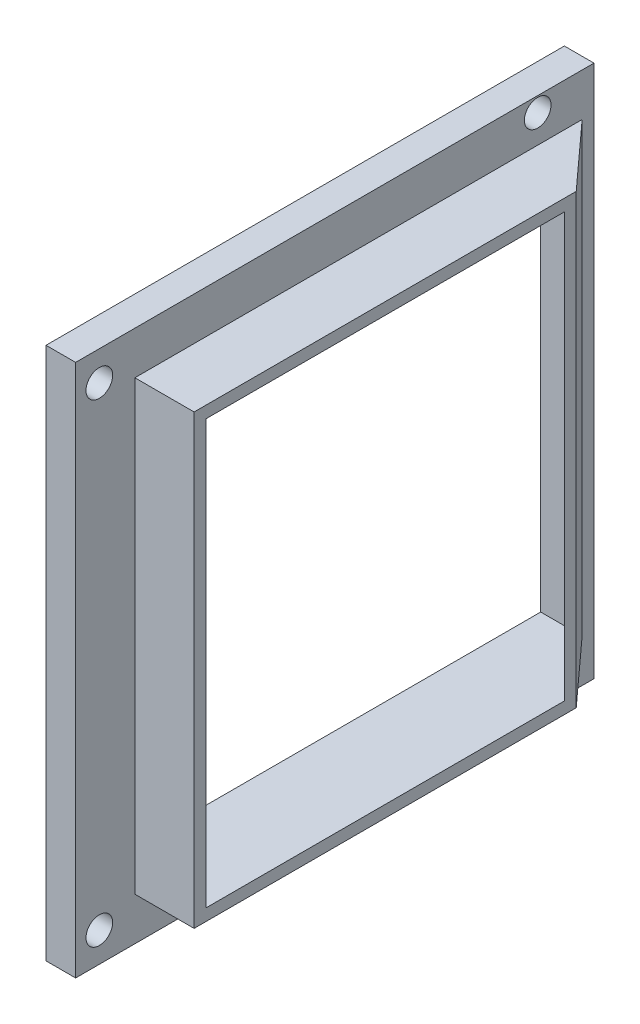
ISO-10303-21;
HEADER;
FILE_DESCRIPTION(('STEP AP214'),'2;1');
FILE_NAME('part.step','',(''),(''),'','','');
FILE_SCHEMA(('AUTOMOTIVE_DESIGN { 1 0 10303 214 1 1 1 1 }'));
ENDSEC;
DATA;
#1=APPLICATION_CONTEXT('core data for automotive mechanical design processes');
#2=APPLICATION_PROTOCOL_DEFINITION('international standard','automotive_design',2000,#1);
#3=PRODUCT_CONTEXT('',#1,'mechanical');
#4=PRODUCT('Part','Part','',(#3));
#5=PRODUCT_RELATED_PRODUCT_CATEGORY('part','',(#4));
#6=PRODUCT_DEFINITION_FORMATION('','',#4);
#7=PRODUCT_DEFINITION_CONTEXT('part definition',#1,'design');
#8=PRODUCT_DEFINITION('design','',#6,#7);
#9=PRODUCT_DEFINITION_SHAPE('','',#8);
#10=(LENGTH_UNIT() NAMED_UNIT(*) SI_UNIT(.MILLI.,.METRE.));
#11=(NAMED_UNIT(*) PLANE_ANGLE_UNIT() SI_UNIT($,.RADIAN.));
#12=(NAMED_UNIT(*) SI_UNIT($,.STERADIAN.) SOLID_ANGLE_UNIT());
#13=UNCERTAINTY_MEASURE_WITH_UNIT(LENGTH_MEASURE(1.E-05),#10,'distance_accuracy_value','');
#14=(GEOMETRIC_REPRESENTATION_CONTEXT(3) GLOBAL_UNCERTAINTY_ASSIGNED_CONTEXT((#13)) GLOBAL_UNIT_ASSIGNED_CONTEXT((#10,
#11,#12)) REPRESENTATION_CONTEXT('',''));
#15=CARTESIAN_POINT('',(0.,0.,0.));
#16=DIRECTION('',(0.,0.,1.));
#17=DIRECTION('',(1.,0.,0.));
#18=AXIS2_PLACEMENT_3D('',#15,#16,#17);
#19=CARTESIAN_POINT('',(5.,0.,0.));
#20=DIRECTION('',(-1.,0.,0.));
#21=DIRECTION('',(0.,0.,1.));
#22=AXIS2_PLACEMENT_3D('',#19,#20,#21);
#23=PLANE('',#22);
#24=CARTESIAN_POINT('',(5.,40.,39.75));
#25=DIRECTION('',(1.,0.,0.));
#26=DIRECTION('',(0.,0.,-1.));
#27=AXIS2_PLACEMENT_3D('',#24,#25,#26);
#28=CIRCLE('',#27,2.25);
#29=CARTESIAN_POINT('',(5.,40.,37.5));
#30=VERTEX_POINT('',#29);
#31=EDGE_CURVE('E191',#30,#30,#28,.T.);
#32=ORIENTED_EDGE('',*,*,#31,.F.);
#33=EDGE_LOOP('',(#32));
#34=FACE_BOUND('',#33,.T.);
#35=CARTESIAN_POINT('',(5.,42.5,-34.25));
#36=DIRECTION('',(1.,0.,0.));
#37=DIRECTION('',(0.,0.,-1.));
#38=AXIS2_PLACEMENT_3D('',#35,#36,#37);
#39=CIRCLE('',#38,2.25);
#40=CARTESIAN_POINT('',(5.,42.5,-36.5));
#41=VERTEX_POINT('',#40);
#42=EDGE_CURVE('E199',#41,#41,#39,.T.);
#43=ORIENTED_EDGE('',*,*,#42,.F.);
#44=EDGE_LOOP('',(#43));
#45=FACE_BOUND('',#44,.T.);
#46=CARTESIAN_POINT('',(5.,-42.5,-34.25));
#47=DIRECTION('',(1.,0.,0.));
#48=DIRECTION('',(0.,0.,-1.));
#49=AXIS2_PLACEMENT_3D('',#46,#47,#48);
#50=CIRCLE('',#49,2.25);
#51=CARTESIAN_POINT('',(5.,-42.5,-36.5));
#52=VERTEX_POINT('',#51);
#53=EDGE_CURVE('E186',#52,#52,#50,.T.);
#54=ORIENTED_EDGE('',*,*,#53,.F.);
#55=EDGE_LOOP('',(#54));
#56=FACE_BOUND('',#55,.T.);
#57=DIRECTION('',(0.,-1.,0.));
#58=VECTOR('',#57,1.);
#59=CARTESIAN_POINT('',(5.,-45.,43.75));
#60=LINE('',#59,#58);
#61=CARTESIAN_POINT('',(5.,45.,43.75));
#62=VERTEX_POINT('',#61);
#63=CARTESIAN_POINT('',(5.,-45.,43.75));
#64=VERTEX_POINT('',#63);
#65=EDGE_CURVE('E245',#62,#64,#60,.T.);
#66=ORIENTED_EDGE('',*,*,#65,.T.);
#67=DIRECTION('',(0.,0.,-1.));
#68=VECTOR('',#67,1.);
#69=CARTESIAN_POINT('',(5.,-45.,43.75));
#70=LINE('',#69,#68);
#71=CARTESIAN_POINT('',(5.,-45.,-43.75));
#72=VERTEX_POINT('',#71);
#73=EDGE_CURVE('E248',#64,#72,#70,.T.);
#74=ORIENTED_EDGE('',*,*,#73,.T.);
#75=DIRECTION('',(0.,1.,0.));
#76=VECTOR('',#75,1.);
#77=CARTESIAN_POINT('',(5.,-45.,-43.75));
#78=LINE('',#77,#76);
#79=CARTESIAN_POINT('',(5.,45.,-43.75));
#80=VERTEX_POINT('',#79);
#81=EDGE_CURVE('E238',#72,#80,#78,.T.);
#82=ORIENTED_EDGE('',*,*,#81,.T.);
#83=DIRECTION('',(0.,0.,1.));
#84=VECTOR('',#83,1.);
#85=CARTESIAN_POINT('',(5.,45.,43.75));
#86=LINE('',#85,#84);
#87=EDGE_CURVE('E241',#80,#62,#86,.T.);
#88=ORIENTED_EDGE('',*,*,#87,.T.);
#89=EDGE_LOOP('',(#66,#74,#82,#88));
#90=FACE_BOUND('',#89,.T.);
#91=CARTESIAN_POINT('',(5.,-40.,39.75));
#92=DIRECTION('',(1.,0.,0.));
#93=DIRECTION('',(0.,0.,-1.));
#94=AXIS2_PLACEMENT_3D('',#91,#92,#93);
#95=CIRCLE('',#94,2.25);
#96=CARTESIAN_POINT('',(5.,-40.,37.5));
#97=VERTEX_POINT('',#96);
#98=EDGE_CURVE('E176',#97,#97,#95,.T.);
#99=ORIENTED_EDGE('',*,*,#98,.F.);
#100=EDGE_LOOP('',(#99));
#101=FACE_BOUND('',#100,.T.);
#102=DIRECTION('',(0.,1.,0.));
#103=VECTOR('',#102,1.);
#104=CARTESIAN_POINT('',(5.,-45.,-41.75));
#105=LINE('',#104,#103);
#106=CARTESIAN_POINT('',(5.,-37.75,-41.75));
#107=VERTEX_POINT('',#106);
#108=CARTESIAN_POINT('',(5.,37.75,-41.75));
#109=VERTEX_POINT('',#108);
#110=EDGE_CURVE('E159',#107,#109,#105,.T.);
#111=ORIENTED_EDGE('',*,*,#110,.F.);
#112=DIRECTION('',(0.,0.,-1.));
#113=VECTOR('',#112,1.);
#114=CARTESIAN_POINT('',(5.,-37.75,43.75));
#115=LINE('',#114,#113);
#116=CARTESIAN_POINT('',(5.,-37.75,33.75));
#117=VERTEX_POINT('',#116);
#118=EDGE_CURVE('E146',#117,#107,#115,.T.);
#119=ORIENTED_EDGE('',*,*,#118,.F.);
#120=DIRECTION('',(0.,1.,0.));
#121=VECTOR('',#120,1.);
#122=CARTESIAN_POINT('',(5.,-45.,33.75));
#123=LINE('',#122,#121);
#124=CARTESIAN_POINT('',(5.,37.75,33.75));
#125=VERTEX_POINT('',#124);
#126=EDGE_CURVE('E163',#117,#125,#123,.T.);
#127=ORIENTED_EDGE('',*,*,#126,.T.);
#128=DIRECTION('',(0.,0.,-1.));
#129=VECTOR('',#128,1.);
#130=CARTESIAN_POINT('',(5.,37.75,43.75));
#131=LINE('',#130,#129);
#132=EDGE_CURVE('E357',#125,#109,#131,.T.);
#133=ORIENTED_EDGE('',*,*,#132,.T.);
#134=EDGE_LOOP('',(#111,#119,#127,#133));
#135=FACE_BOUND('',#134,.T.);
#136=ADVANCED_FACE('F41',(#34,#45,#56,#90,#101,#135),#23,.F.);
#137=CARTESIAN_POINT('',(5.,-45.,43.75));
#138=DIRECTION('',(0.,1.,0.));
#139=DIRECTION('',(0.,0.,1.));
#140=AXIS2_PLACEMENT_3D('',#137,#138,#139);
#141=PLANE('',#140);
#142=DIRECTION('',(-1.,0.,0.));
#143=VECTOR('',#142,1.);
#144=CARTESIAN_POINT('',(5.,-45.,-43.75));
#145=LINE('',#144,#143);
#146=CARTESIAN_POINT('',(0.,-45.,-43.75));
#147=VERTEX_POINT('',#146);
#148=EDGE_CURVE('E251',#72,#147,#145,.T.);
#149=ORIENTED_EDGE('',*,*,#148,.F.);
#150=ORIENTED_EDGE('',*,*,#73,.F.);
#151=DIRECTION('',(-1.,0.,0.));
#152=VECTOR('',#151,1.);
#153=CARTESIAN_POINT('',(5.,-45.,43.75));
#154=LINE('',#153,#152);
#155=CARTESIAN_POINT('',(0.,-45.,43.75));
#156=VERTEX_POINT('',#155);
#157=EDGE_CURVE('E266',#64,#156,#154,.T.);
#158=ORIENTED_EDGE('',*,*,#157,.T.);
#159=DIRECTION('',(0.,0.,-1.));
#160=VECTOR('',#159,1.);
#161=CARTESIAN_POINT('',(0.,-45.,43.75));
#162=LINE('',#161,#160);
#163=EDGE_CURVE('E242',#156,#147,#162,.T.);
#164=ORIENTED_EDGE('',*,*,#163,.T.);
#165=EDGE_LOOP('',(#149,#150,#158,#164));
#166=FACE_BOUND('',#165,.T.);
#167=ADVANCED_FACE('F315',(#166),#141,.F.);
#168=CARTESIAN_POINT('',(5.,45.,43.75));
#169=DIRECTION('',(0.,-1.,0.));
#170=DIRECTION('',(0.,0.,-1.));
#171=AXIS2_PLACEMENT_3D('',#168,#169,#170);
#172=PLANE('',#171);
#173=DIRECTION('',(-1.,0.,0.));
#174=VECTOR('',#173,1.);
#175=CARTESIAN_POINT('',(5.,45.,43.75));
#176=LINE('',#175,#174);
#177=CARTESIAN_POINT('',(0.,45.,43.75));
#178=VERTEX_POINT('',#177);
#179=EDGE_CURVE('E270',#62,#178,#176,.T.);
#180=ORIENTED_EDGE('',*,*,#179,.F.);
#181=ORIENTED_EDGE('',*,*,#87,.F.);
#182=DIRECTION('',(-1.,0.,0.));
#183=VECTOR('',#182,1.);
#184=CARTESIAN_POINT('',(5.,45.,-43.75));
#185=LINE('',#184,#183);
#186=CARTESIAN_POINT('',(0.,45.,-43.75));
#187=VERTEX_POINT('',#186);
#188=EDGE_CURVE('E50',#80,#187,#185,.T.);
#189=ORIENTED_EDGE('',*,*,#188,.T.);
#190=DIRECTION('',(0.,0.,1.));
#191=VECTOR('',#190,1.);
#192=CARTESIAN_POINT('',(0.,45.,43.75));
#193=LINE('',#192,#191);
#194=EDGE_CURVE('E255',#187,#178,#193,.T.);
#195=ORIENTED_EDGE('',*,*,#194,.T.);
#196=EDGE_LOOP('',(#180,#181,#189,#195));
#197=FACE_BOUND('',#196,.T.);
#198=ADVANCED_FACE('F307',(#197),#172,.F.);
#199=CARTESIAN_POINT('',(5.,-35.75,31.75));
#200=DIRECTION('',(0.,0.,-1.));
#201=DIRECTION('',(-1.,0.,0.));
#202=AXIS2_PLACEMENT_3D('',#199,#200,#201);
#203=PLANE('',#202);
#204=DIRECTION('',(0.,1.,0.));
#205=VECTOR('',#204,1.);
#206=CARTESIAN_POINT('',(15.,-45.,31.75));
#207=LINE('',#206,#205);
#208=CARTESIAN_POINT('',(15.,-35.75,31.75));
#209=VERTEX_POINT('',#208);
#210=CARTESIAN_POINT('',(15.,35.75,31.75));
#211=VERTEX_POINT('',#210);
#212=EDGE_CURVE('E57',#209,#211,#207,.T.);
#213=ORIENTED_EDGE('',*,*,#212,.F.);
#214=DIRECTION('',(-1.,0.,0.));
#215=VECTOR('',#214,1.);
#216=CARTESIAN_POINT('',(5.,-35.75,31.75));
#217=LINE('',#216,#215);
#218=CARTESIAN_POINT('',(0.,-35.75,31.75));
#219=VERTEX_POINT('',#218);
#220=EDGE_CURVE('E144',#209,#219,#217,.T.);
#221=ORIENTED_EDGE('',*,*,#220,.T.);
#222=DIRECTION('',(0.,-1.,0.));
#223=VECTOR('',#222,1.);
#224=CARTESIAN_POINT('',(0.,-35.75,31.75));
#225=LINE('',#224,#223);
#226=CARTESIAN_POINT('',(0.,35.75,31.75));
#227=VERTEX_POINT('',#226);
#228=EDGE_CURVE('E219',#227,#219,#225,.T.);
#229=ORIENTED_EDGE('',*,*,#228,.F.);
#230=DIRECTION('',(-1.,0.,0.));
#231=VECTOR('',#230,1.);
#232=CARTESIAN_POINT('',(5.,35.75,31.75));
#233=LINE('',#232,#231);
#234=EDGE_CURVE('E230',#211,#227,#233,.T.);
#235=ORIENTED_EDGE('',*,*,#234,.F.);
#236=EDGE_LOOP('',(#213,#221,#229,#235));
#237=FACE_BOUND('',#236,.T.);
#238=ADVANCED_FACE('F304',(#237),#203,.T.);
#239=CARTESIAN_POINT('',(0.,-45.,33.75));
#240=DIRECTION('',(0.,0.,1.));
#241=DIRECTION('',(1.,0.,0.));
#242=AXIS2_PLACEMENT_3D('',#239,#240,#241);
#243=PLANE('',#242);
#244=DIRECTION('',(-1.,0.,0.));
#245=VECTOR('',#244,1.);
#246=CARTESIAN_POINT('',(0.,-37.75,33.75));
#247=LINE('',#246,#245);
#248=CARTESIAN_POINT('',(15.,-37.75,33.75));
#249=VERTEX_POINT('',#248);
#250=EDGE_CURVE('E366',#249,#117,#247,.T.);
#251=ORIENTED_EDGE('',*,*,#250,.F.);
#252=DIRECTION('',(0.,1.,0.));
#253=VECTOR('',#252,1.);
#254=CARTESIAN_POINT('',(15.,-45.,33.75));
#255=LINE('',#254,#253);
#256=CARTESIAN_POINT('',(15.,37.75,33.75));
#257=VERTEX_POINT('',#256);
#258=EDGE_CURVE('E173',#249,#257,#255,.T.);
#259=ORIENTED_EDGE('',*,*,#258,.T.);
#260=DIRECTION('',(-1.,0.,0.));
#261=VECTOR('',#260,1.);
#262=CARTESIAN_POINT('',(0.,37.75,33.75));
#263=LINE('',#262,#261);
#264=EDGE_CURVE('E168',#257,#125,#263,.T.);
#265=ORIENTED_EDGE('',*,*,#264,.T.);
#266=ORIENTED_EDGE('',*,*,#126,.F.);
#267=EDGE_LOOP('',(#251,#259,#265,#266));
#268=FACE_BOUND('',#267,.T.);
#269=ADVANCED_FACE('F306',(#268),#243,.T.);
#270=CARTESIAN_POINT('',(15.,-45.,0.));
#271=DIRECTION('',(1.,0.,0.));
#272=DIRECTION('',(0.,0.,-1.));
#273=AXIS2_PLACEMENT_3D('',#270,#271,#272);
#274=PLANE('',#273);
#275=DIRECTION('',(0.,0.,-1.));
#276=VECTOR('',#275,1.);
#277=CARTESIAN_POINT('',(15.,-35.75,-28.75));
#278=LINE('',#277,#276);
#279=CARTESIAN_POINT('',(15.,-35.75,-28.75));
#280=VERTEX_POINT('',#279);
#281=EDGE_CURVE('E138',#209,#280,#278,.T.);
#282=ORIENTED_EDGE('',*,*,#281,.F.);
#283=ORIENTED_EDGE('',*,*,#212,.T.);
#284=DIRECTION('',(0.,0.,-1.));
#285=VECTOR('',#284,1.);
#286=CARTESIAN_POINT('',(15.,35.75,-28.75));
#287=LINE('',#286,#285);
#288=CARTESIAN_POINT('',(15.,35.75,-28.75));
#289=VERTEX_POINT('',#288);
#290=EDGE_CURVE('E157',#211,#289,#287,.T.);
#291=ORIENTED_EDGE('',*,*,#290,.T.);
#292=DIRECTION('',(0.,1.,0.));
#293=VECTOR('',#292,1.);
#294=CARTESIAN_POINT('',(15.,-45.,-28.75));
#295=LINE('',#294,#293);
#296=EDGE_CURVE('E65',#280,#289,#295,.T.);
#297=ORIENTED_EDGE('',*,*,#296,.F.);
#298=EDGE_LOOP('',(#282,#283,#291,#297));
#299=FACE_BOUND('',#298,.T.);
#300=DIRECTION('',(0.,0.,-1.));
#301=VECTOR('',#300,1.);
#302=CARTESIAN_POINT('',(15.,-37.75,43.75));
#303=LINE('',#302,#301);
#304=CARTESIAN_POINT('',(15.,-37.75,-30.75));
#305=VERTEX_POINT('',#304);
#306=EDGE_CURVE('E367',#249,#305,#303,.T.);
#307=ORIENTED_EDGE('',*,*,#306,.T.);
#308=DIRECTION('',(0.,1.,0.));
#309=VECTOR('',#308,1.);
#310=CARTESIAN_POINT('',(15.,-45.,-30.75));
#311=LINE('',#310,#309);
#312=CARTESIAN_POINT('',(15.,37.75,-30.75));
#313=VERTEX_POINT('',#312);
#314=EDGE_CURVE('E165',#305,#313,#311,.T.);
#315=ORIENTED_EDGE('',*,*,#314,.T.);
#316=DIRECTION('',(0.,0.,-1.));
#317=VECTOR('',#316,1.);
#318=CARTESIAN_POINT('',(15.,37.75,43.75));
#319=LINE('',#318,#317);
#320=EDGE_CURVE('E379',#257,#313,#319,.T.);
#321=ORIENTED_EDGE('',*,*,#320,.F.);
#322=ORIENTED_EDGE('',*,*,#258,.F.);
#323=EDGE_LOOP('',(#307,#315,#321,#322));
#324=FACE_BOUND('',#323,.T.);
#325=ADVANCED_FACE('F154',(#299,#324),#274,.T.);
#326=CARTESIAN_POINT('',(22.5226244343891,-45.,-20.4751131221719));
#327=DIRECTION('',(-0.739940073395944,0.,0.672672793996312));
#328=DIRECTION('',(0.672672793996312,0.,0.739940073395944));
#329=AXIS2_PLACEMENT_3D('',#326,#327,#328);
#330=PLANE('',#329);
#331=DIRECTION('',(-0.672672793996312,0.,-0.739940073395944));
#332=VECTOR('',#331,1.);
#333=CARTESIAN_POINT('',(5.,-35.75,-39.75));
#334=LINE('',#333,#332);
#335=CARTESIAN_POINT('',(5.,-35.75,-39.75));
#336=VERTEX_POINT('',#335);
#337=EDGE_CURVE('E142',#280,#336,#334,.T.);
#338=ORIENTED_EDGE('',*,*,#337,.F.);
#339=ORIENTED_EDGE('',*,*,#296,.T.);
#340=DIRECTION('',(-0.672672793996312,0.,-0.739940073395944));
#341=VECTOR('',#340,1.);
#342=CARTESIAN_POINT('',(5.,35.75,-39.75));
#343=LINE('',#342,#341);
#344=CARTESIAN_POINT('',(5.,35.75,-39.75));
#345=VERTEX_POINT('',#344);
#346=EDGE_CURVE('E302',#289,#345,#343,.T.);
#347=ORIENTED_EDGE('',*,*,#346,.T.);
#348=DIRECTION('',(0.,1.,0.));
#349=VECTOR('',#348,1.);
#350=CARTESIAN_POINT('',(5.,-35.75,-39.75));
#351=LINE('',#350,#349);
#352=EDGE_CURVE('E150',#336,#345,#351,.T.);
#353=ORIENTED_EDGE('',*,*,#352,.F.);
#354=EDGE_LOOP('',(#338,#339,#347,#353));
#355=FACE_BOUND('',#354,.T.);
#356=ADVANCED_FACE('F148',(#355),#330,.T.);
#357=CARTESIAN_POINT('',(23.5180995475113,-45.,-21.3800904977376));
#358=DIRECTION('',(0.739940073395944,0.,-0.672672793996312));
#359=DIRECTION('',(-0.672672793996312,0.,-0.739940073395944));
#360=AXIS2_PLACEMENT_3D('',#357,#358,#359);
#361=PLANE('',#360);
#362=DIRECTION('',(0.672672793996312,0.,0.739940073395944));
#363=VECTOR('',#362,1.);
#364=CARTESIAN_POINT('',(23.5180995475113,-37.75,-21.3800904977376));
#365=LINE('',#364,#363);
#366=EDGE_CURVE('E363',#107,#305,#365,.T.);
#367=ORIENTED_EDGE('',*,*,#366,.F.);
#368=ORIENTED_EDGE('',*,*,#110,.T.);
#369=DIRECTION('',(0.672672793996312,0.,0.739940073395944));
#370=VECTOR('',#369,1.);
#371=CARTESIAN_POINT('',(23.5180995475113,37.75,-21.3800904977376));
#372=LINE('',#371,#370);
#373=EDGE_CURVE('E11',#109,#313,#372,.T.);
#374=ORIENTED_EDGE('',*,*,#373,.T.);
#375=ORIENTED_EDGE('',*,*,#314,.F.);
#376=EDGE_LOOP('',(#367,#368,#374,#375));
#377=FACE_BOUND('',#376,.T.);
#378=ADVANCED_FACE('F286',(#377),#361,.T.);
#379=CARTESIAN_POINT('',(0.,0.,0.));
#380=DIRECTION('',(-1.,0.,0.));
#381=DIRECTION('',(0.,0.,1.));
#382=AXIS2_PLACEMENT_3D('',#379,#380,#381);
#383=PLANE('',#382);
#384=CARTESIAN_POINT('',(0.,-40.,39.75));
#385=DIRECTION('',(-1.,0.,0.));
#386=DIRECTION('',(0.,0.,1.));
#387=AXIS2_PLACEMENT_3D('',#384,#385,#386);
#388=CIRCLE('',#387,2.25);
#389=CARTESIAN_POINT('',(0.,-40.,42.));
#390=VERTEX_POINT('',#389);
#391=EDGE_CURVE('E182',#390,#390,#388,.T.);
#392=ORIENTED_EDGE('',*,*,#391,.F.);
#393=EDGE_LOOP('',(#392));
#394=FACE_BOUND('',#393,.T.);
#395=CARTESIAN_POINT('',(0.,-42.5,-34.25));
#396=DIRECTION('',(-1.,0.,0.));
#397=DIRECTION('',(0.,0.,1.));
#398=AXIS2_PLACEMENT_3D('',#395,#396,#397);
#399=CIRCLE('',#398,2.25);
#400=CARTESIAN_POINT('',(0.,-42.5,-32.));
#401=VERTEX_POINT('',#400);
#402=EDGE_CURVE('E190',#401,#401,#399,.T.);
#403=ORIENTED_EDGE('',*,*,#402,.F.);
#404=EDGE_LOOP('',(#403));
#405=FACE_BOUND('',#404,.T.);
#406=CARTESIAN_POINT('',(0.,40.,39.75));
#407=DIRECTION('',(-1.,0.,0.));
#408=DIRECTION('',(0.,0.,1.));
#409=AXIS2_PLACEMENT_3D('',#406,#407,#408);
#410=CIRCLE('',#409,2.25);
#411=CARTESIAN_POINT('',(0.,40.,42.));
#412=VERTEX_POINT('',#411);
#413=EDGE_CURVE('E195',#412,#412,#410,.T.);
#414=ORIENTED_EDGE('',*,*,#413,.F.);
#415=EDGE_LOOP('',(#414));
#416=FACE_BOUND('',#415,.T.);
#417=CARTESIAN_POINT('',(0.,42.5,-34.25));
#418=DIRECTION('',(-1.,0.,0.));
#419=DIRECTION('',(0.,0.,1.));
#420=AXIS2_PLACEMENT_3D('',#417,#418,#419);
#421=CIRCLE('',#420,2.25);
#422=CARTESIAN_POINT('',(0.,42.5,-32.));
#423=VERTEX_POINT('',#422);
#424=EDGE_CURVE('E203',#423,#423,#421,.T.);
#425=ORIENTED_EDGE('',*,*,#424,.F.);
#426=EDGE_LOOP('',(#425));
#427=FACE_BOUND('',#426,.T.);
#428=DIRECTION('',(0.,1.,0.));
#429=VECTOR('',#428,1.);
#430=CARTESIAN_POINT('',(0.,-45.,-43.75));
#431=LINE('',#430,#429);
#432=EDGE_CURVE('E237',#147,#187,#431,.T.);
#433=ORIENTED_EDGE('',*,*,#432,.F.);
#434=ORIENTED_EDGE('',*,*,#163,.F.);
#435=DIRECTION('',(0.,-1.,0.));
#436=VECTOR('',#435,1.);
#437=CARTESIAN_POINT('',(0.,-45.,43.75));
#438=LINE('',#437,#436);
#439=EDGE_CURVE('E258',#178,#156,#438,.T.);
#440=ORIENTED_EDGE('',*,*,#439,.F.);
#441=ORIENTED_EDGE('',*,*,#194,.F.);
#442=EDGE_LOOP('',(#433,#434,#440,#441));
#443=FACE_BOUND('',#442,.T.);
#444=DIRECTION('',(0.,0.,-1.));
#445=VECTOR('',#444,1.);
#446=CARTESIAN_POINT('',(0.,-35.75,31.75));
#447=LINE('',#446,#445);
#448=CARTESIAN_POINT('',(0.,-35.75,-39.75));
#449=VERTEX_POINT('',#448);
#450=EDGE_CURVE('E211',#219,#449,#447,.T.);
#451=ORIENTED_EDGE('',*,*,#450,.T.);
#452=DIRECTION('',(0.,1.,0.));
#453=VECTOR('',#452,1.);
#454=CARTESIAN_POINT('',(0.,-35.75,-39.75));
#455=LINE('',#454,#453);
#456=CARTESIAN_POINT('',(0.,35.75,-39.75));
#457=VERTEX_POINT('',#456);
#458=EDGE_CURVE('E207',#449,#457,#455,.T.);
#459=ORIENTED_EDGE('',*,*,#458,.T.);
#460=DIRECTION('',(0.,0.,1.));
#461=VECTOR('',#460,1.);
#462=CARTESIAN_POINT('',(0.,35.75,31.75));
#463=LINE('',#462,#461);
#464=EDGE_CURVE('E215',#457,#227,#463,.T.);
#465=ORIENTED_EDGE('',*,*,#464,.T.);
#466=ORIENTED_EDGE('',*,*,#228,.T.);
#467=EDGE_LOOP('',(#451,#459,#465,#466));
#468=FACE_BOUND('',#467,.T.);
#469=ADVANCED_FACE('F283',(#394,#405,#416,#427,#443,#468),#383,.T.);
#470=CARTESIAN_POINT('',(5.,-45.,-43.75));
#471=DIRECTION('',(0.,0.,1.));
#472=DIRECTION('',(1.,0.,0.));
#473=AXIS2_PLACEMENT_3D('',#470,#471,#472);
#474=PLANE('',#473);
#475=ORIENTED_EDGE('',*,*,#432,.T.);
#476=ORIENTED_EDGE('',*,*,#188,.F.);
#477=ORIENTED_EDGE('',*,*,#81,.F.);
#478=ORIENTED_EDGE('',*,*,#148,.T.);
#479=EDGE_LOOP('',(#475,#476,#477,#478));
#480=FACE_BOUND('',#479,.T.);
#481=ADVANCED_FACE('F43',(#480),#474,.F.);
#482=CARTESIAN_POINT('',(5.,-45.,43.75));
#483=DIRECTION('',(0.,0.,-1.));
#484=DIRECTION('',(-1.,0.,0.));
#485=AXIS2_PLACEMENT_3D('',#482,#483,#484);
#486=PLANE('',#485);
#487=ORIENTED_EDGE('',*,*,#439,.T.);
#488=ORIENTED_EDGE('',*,*,#157,.F.);
#489=ORIENTED_EDGE('',*,*,#65,.F.);
#490=ORIENTED_EDGE('',*,*,#179,.T.);
#491=EDGE_LOOP('',(#487,#488,#489,#490));
#492=FACE_BOUND('',#491,.T.);
#493=ADVANCED_FACE('F331',(#492),#486,.F.);
#494=CARTESIAN_POINT('',(5.,-35.75,-39.75));
#495=DIRECTION('',(0.,0.,1.));
#496=DIRECTION('',(1.,0.,0.));
#497=AXIS2_PLACEMENT_3D('',#494,#495,#496);
#498=PLANE('',#497);
#499=ORIENTED_EDGE('',*,*,#458,.F.);
#500=DIRECTION('',(-1.,0.,0.));
#501=VECTOR('',#500,1.);
#502=CARTESIAN_POINT('',(5.,-35.75,-39.75));
#503=LINE('',#502,#501);
#504=EDGE_CURVE('E210',#336,#449,#503,.T.);
#505=ORIENTED_EDGE('',*,*,#504,.F.);
#506=ORIENTED_EDGE('',*,*,#352,.T.);
#507=DIRECTION('',(-1.,0.,0.));
#508=VECTOR('',#507,1.);
#509=CARTESIAN_POINT('',(5.,35.75,-39.75));
#510=LINE('',#509,#508);
#511=EDGE_CURVE('E233',#345,#457,#510,.T.);
#512=ORIENTED_EDGE('',*,*,#511,.T.);
#513=EDGE_LOOP('',(#499,#505,#506,#512));
#514=FACE_BOUND('',#513,.T.);
#515=ADVANCED_FACE('F298',(#514),#498,.T.);
#516=CARTESIAN_POINT('',(5.,35.75,31.75));
#517=DIRECTION('',(0.,-1.,0.));
#518=DIRECTION('',(0.,0.,-1.));
#519=AXIS2_PLACEMENT_3D('',#516,#517,#518);
#520=PLANE('',#519);
#521=ORIENTED_EDGE('',*,*,#464,.F.);
#522=ORIENTED_EDGE('',*,*,#511,.F.);
#523=ORIENTED_EDGE('',*,*,#346,.F.);
#524=ORIENTED_EDGE('',*,*,#290,.F.);
#525=ORIENTED_EDGE('',*,*,#234,.T.);
#526=EDGE_LOOP('',(#521,#522,#523,#524,#525));
#527=FACE_BOUND('',#526,.T.);
#528=ADVANCED_FACE('F301',(#527),#520,.T.);
#529=CARTESIAN_POINT('',(5.,-35.75,31.75));
#530=DIRECTION('',(0.,1.,0.));
#531=DIRECTION('',(0.,0.,1.));
#532=AXIS2_PLACEMENT_3D('',#529,#530,#531);
#533=PLANE('',#532);
#534=ORIENTED_EDGE('',*,*,#450,.F.);
#535=ORIENTED_EDGE('',*,*,#220,.F.);
#536=ORIENTED_EDGE('',*,*,#281,.T.);
#537=ORIENTED_EDGE('',*,*,#337,.T.);
#538=ORIENTED_EDGE('',*,*,#504,.T.);
#539=EDGE_LOOP('',(#534,#535,#536,#537,#538));
#540=FACE_BOUND('',#539,.T.);
#541=ADVANCED_FACE('F140',(#540),#533,.T.);
#542=CARTESIAN_POINT('',(5.,42.5,-34.25));
#543=DIRECTION('',(1.,0.,0.));
#544=DIRECTION('',(0.,0.,-1.));
#545=AXIS2_PLACEMENT_3D('',#542,#543,#544);
#546=CYLINDRICAL_SURFACE('',#545,2.25);
#547=ORIENTED_EDGE('',*,*,#424,.T.);
#548=EDGE_LOOP('',(#547));
#549=FACE_BOUND('',#548,.T.);
#550=ORIENTED_EDGE('',*,*,#42,.T.);
#551=EDGE_LOOP('',(#550));
#552=FACE_BOUND('',#551,.T.);
#553=ADVANCED_FACE('F415',(#549,#552),#546,.F.);
#554=CARTESIAN_POINT('',(5.,40.,39.75));
#555=DIRECTION('',(1.,0.,0.));
#556=DIRECTION('',(0.,0.,-1.));
#557=AXIS2_PLACEMENT_3D('',#554,#555,#556);
#558=CYLINDRICAL_SURFACE('',#557,2.25);
#559=ORIENTED_EDGE('',*,*,#413,.T.);
#560=EDGE_LOOP('',(#559));
#561=FACE_BOUND('',#560,.T.);
#562=ORIENTED_EDGE('',*,*,#31,.T.);
#563=EDGE_LOOP('',(#562));
#564=FACE_BOUND('',#563,.T.);
#565=ADVANCED_FACE('F412',(#561,#564),#558,.F.);
#566=CARTESIAN_POINT('',(5.,-42.5,-34.25));
#567=DIRECTION('',(1.,0.,0.));
#568=DIRECTION('',(0.,0.,-1.));
#569=AXIS2_PLACEMENT_3D('',#566,#567,#568);
#570=CYLINDRICAL_SURFACE('',#569,2.25);
#571=ORIENTED_EDGE('',*,*,#402,.T.);
#572=EDGE_LOOP('',(#571));
#573=FACE_BOUND('',#572,.T.);
#574=ORIENTED_EDGE('',*,*,#53,.T.);
#575=EDGE_LOOP('',(#574));
#576=FACE_BOUND('',#575,.T.);
#577=ADVANCED_FACE('F280',(#573,#576),#570,.F.);
#578=CARTESIAN_POINT('',(5.,-40.,39.75));
#579=DIRECTION('',(1.,0.,0.));
#580=DIRECTION('',(0.,0.,-1.));
#581=AXIS2_PLACEMENT_3D('',#578,#579,#580);
#582=CYLINDRICAL_SURFACE('',#581,2.25);
#583=ORIENTED_EDGE('',*,*,#391,.T.);
#584=EDGE_LOOP('',(#583));
#585=FACE_BOUND('',#584,.T.);
#586=ORIENTED_EDGE('',*,*,#98,.T.);
#587=EDGE_LOOP('',(#586));
#588=FACE_BOUND('',#587,.T.);
#589=ADVANCED_FACE('F398',(#585,#588),#582,.F.);
#590=CARTESIAN_POINT('',(15.,37.75,43.75));
#591=DIRECTION('',(0.,1.,0.));
#592=DIRECTION('',(0.,0.,1.));
#593=AXIS2_PLACEMENT_3D('',#590,#591,#592);
#594=PLANE('',#593);
#595=ORIENTED_EDGE('',*,*,#132,.F.);
#596=ORIENTED_EDGE('',*,*,#264,.F.);
#597=ORIENTED_EDGE('',*,*,#320,.T.);
#598=ORIENTED_EDGE('',*,*,#373,.F.);
#599=EDGE_LOOP('',(#595,#596,#597,#598));
#600=FACE_BOUND('',#599,.T.);
#601=ADVANCED_FACE('F390',(#600),#594,.T.);
#602=CARTESIAN_POINT('',(15.,-37.75,43.75));
#603=DIRECTION('',(0.,1.,0.));
#604=DIRECTION('',(0.,0.,1.));
#605=AXIS2_PLACEMENT_3D('',#602,#603,#604);
#606=PLANE('',#605);
#607=ORIENTED_EDGE('',*,*,#118,.T.);
#608=ORIENTED_EDGE('',*,*,#366,.T.);
#609=ORIENTED_EDGE('',*,*,#306,.F.);
#610=ORIENTED_EDGE('',*,*,#250,.T.);
#611=EDGE_LOOP('',(#607,#608,#609,#610));
#612=FACE_BOUND('',#611,.T.);
#613=ADVANCED_FACE('F391',(#612),#606,.F.);
#614=CLOSED_SHELL('',(#136,#167,#198,#238,#269,#325,#356,#378,#469,#481,#493,#515,#528,#541,
#553,#565,#577,#589,#601,#613));
#615=MANIFOLD_SOLID_BREP('B2',#614);
#616=ADVANCED_BREP_SHAPE_REPRESENTATION('',(#18,#615),#14);
#617=SHAPE_DEFINITION_REPRESENTATION(#9,#616);
ENDSEC;
END-ISO-10303-21;
